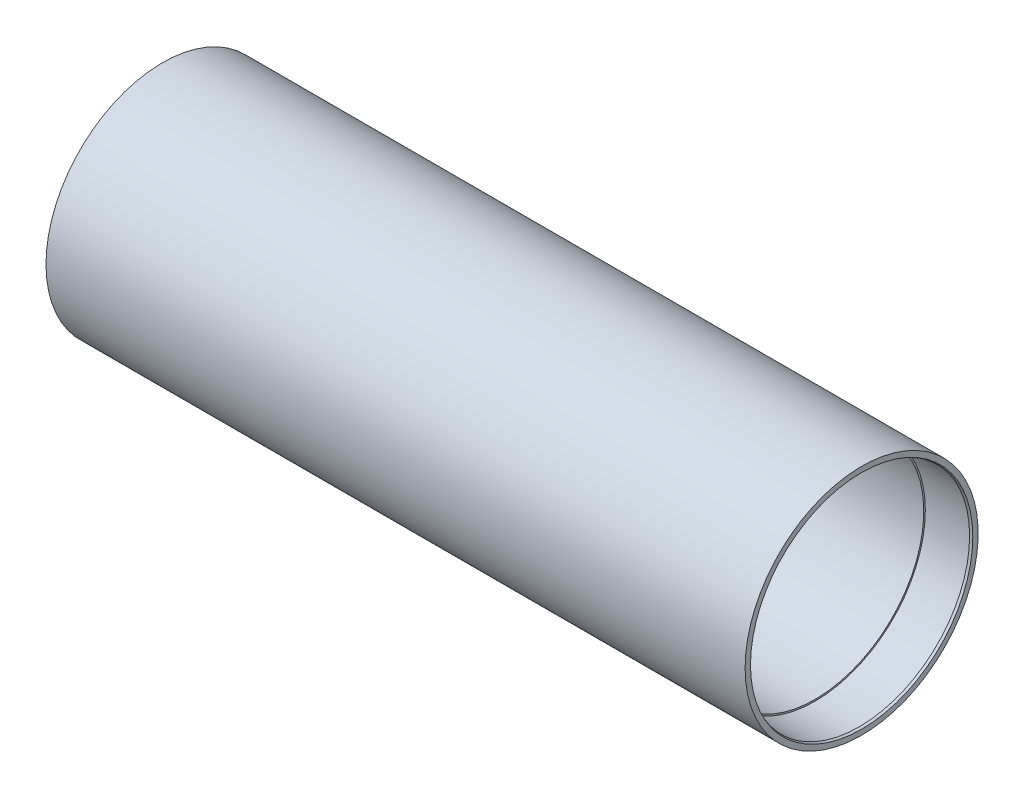
ISO-10303-21;
HEADER;
FILE_DESCRIPTION(('STEP AP214'),'2;1');
FILE_NAME('part.step','',(''),(''),'','','');
FILE_SCHEMA(('AUTOMOTIVE_DESIGN { 1 0 10303 214 1 1 1 1 }'));
ENDSEC;
DATA;
#1=APPLICATION_CONTEXT('core data for automotive mechanical design processes');
#2=APPLICATION_PROTOCOL_DEFINITION('international standard','automotive_design',2000,#1);
#3=PRODUCT_CONTEXT('',#1,'mechanical');
#4=PRODUCT('Part','Part','',(#3));
#5=PRODUCT_RELATED_PRODUCT_CATEGORY('part','',(#4));
#6=PRODUCT_DEFINITION_FORMATION('','',#4);
#7=PRODUCT_DEFINITION_CONTEXT('part definition',#1,'design');
#8=PRODUCT_DEFINITION('design','',#6,#7);
#9=PRODUCT_DEFINITION_SHAPE('','',#8);
#10=(LENGTH_UNIT() NAMED_UNIT(*) SI_UNIT(.MILLI.,.METRE.));
#11=(NAMED_UNIT(*) PLANE_ANGLE_UNIT() SI_UNIT($,.RADIAN.));
#12=(NAMED_UNIT(*) SI_UNIT($,.STERADIAN.) SOLID_ANGLE_UNIT());
#13=UNCERTAINTY_MEASURE_WITH_UNIT(LENGTH_MEASURE(1.E-05),#10,'distance_accuracy_value','');
#14=(GEOMETRIC_REPRESENTATION_CONTEXT(3) GLOBAL_UNCERTAINTY_ASSIGNED_CONTEXT((#13)) GLOBAL_UNIT_ASSIGNED_CONTEXT((#10,
#11,#12)) REPRESENTATION_CONTEXT('',''));
#15=CARTESIAN_POINT('',(0.,0.,0.));
#16=DIRECTION('',(0.,0.,1.));
#17=DIRECTION('',(1.,0.,0.));
#18=AXIS2_PLACEMENT_3D('',#15,#16,#17);
#19=CARTESIAN_POINT('',(0.,0.,0.));
#20=DIRECTION('',(-1.,0.,0.));
#21=DIRECTION('',(0.,0.,1.));
#22=AXIS2_PLACEMENT_3D('',#19,#20,#21);
#23=CYLINDRICAL_SURFACE('',#22,70.);
#24=CARTESIAN_POINT('',(195.,0.,0.));
#25=DIRECTION('',(-1.,0.,0.));
#26=DIRECTION('',(0.,0.,1.));
#27=AXIS2_PLACEMENT_3D('',#24,#25,#26);
#28=CIRCLE('',#27,70.);
#29=CARTESIAN_POINT('',(195.,0.,70.));
#30=VERTEX_POINT('',#29);
#31=EDGE_CURVE('E48',#30,#30,#28,.T.);
#32=ORIENTED_EDGE('',*,*,#31,.F.);
#33=EDGE_LOOP('',(#32));
#34=FACE_BOUND('',#33,.T.);
#35=CARTESIAN_POINT('',(-195.,0.,0.));
#36=DIRECTION('',(-1.,0.,0.));
#37=DIRECTION('',(0.,0.,1.));
#38=AXIS2_PLACEMENT_3D('',#35,#36,#37);
#39=CIRCLE('',#38,70.);
#40=CARTESIAN_POINT('',(-195.,0.,70.));
#41=VERTEX_POINT('',#40);
#42=EDGE_CURVE('E63',#41,#41,#39,.T.);
#43=ORIENTED_EDGE('',*,*,#42,.T.);
#44=EDGE_LOOP('',(#43));
#45=FACE_BOUND('',#44,.T.);
#46=ADVANCED_FACE('F37',(#34,#45),#23,.F.);
#47=CARTESIAN_POINT('',(-225.,75.,0.));
#48=DIRECTION('',(1.,0.,0.));
#49=DIRECTION('',(0.,0.,-1.));
#50=AXIS2_PLACEMENT_3D('',#47,#48,#49);
#51=PLANE('',#50);
#52=CARTESIAN_POINT('',(-225.,0.,0.));
#53=DIRECTION('',(-1.,0.,0.));
#54=DIRECTION('',(0.,0.,1.));
#55=AXIS2_PLACEMENT_3D('',#52,#53,#54);
#56=CIRCLE('',#55,71.55);
#57=CARTESIAN_POINT('',(-225.,0.,71.55));
#58=VERTEX_POINT('',#57);
#59=EDGE_CURVE('E72',#58,#58,#56,.T.);
#60=ORIENTED_EDGE('',*,*,#59,.F.);
#61=EDGE_LOOP('',(#60));
#62=FACE_BOUND('',#61,.T.);
#63=CARTESIAN_POINT('',(-225.,0.,0.));
#64=DIRECTION('',(-1.,0.,0.));
#65=DIRECTION('',(0.,0.,1.));
#66=AXIS2_PLACEMENT_3D('',#63,#64,#65);
#67=CIRCLE('',#66,75.);
#68=CARTESIAN_POINT('',(-225.,0.,75.));
#69=VERTEX_POINT('',#68);
#70=EDGE_CURVE('E44',#69,#69,#67,.T.);
#71=ORIENTED_EDGE('',*,*,#70,.T.);
#72=EDGE_LOOP('',(#71));
#73=FACE_BOUND('',#72,.T.);
#74=ADVANCED_FACE('F39',(#62,#73),#51,.F.);
#75=CARTESIAN_POINT('',(225.,70.,0.));
#76=DIRECTION('',(-1.,0.,0.));
#77=DIRECTION('',(0.,0.,1.));
#78=AXIS2_PLACEMENT_3D('',#75,#76,#77);
#79=PLANE('',#78);
#80=CARTESIAN_POINT('',(225.,0.,0.));
#81=DIRECTION('',(-1.,0.,0.));
#82=DIRECTION('',(0.,0.,1.));
#83=AXIS2_PLACEMENT_3D('',#80,#81,#82);
#84=CIRCLE('',#83,71.55);
#85=CARTESIAN_POINT('',(225.,0.,71.55));
#86=VERTEX_POINT('',#85);
#87=EDGE_CURVE('E60',#86,#86,#84,.T.);
#88=ORIENTED_EDGE('',*,*,#87,.T.);
#89=EDGE_LOOP('',(#88));
#90=FACE_BOUND('',#89,.T.);
#91=CARTESIAN_POINT('',(225.,0.,0.));
#92=DIRECTION('',(-1.,0.,0.));
#93=DIRECTION('',(0.,0.,1.));
#94=AXIS2_PLACEMENT_3D('',#91,#92,#93);
#95=CIRCLE('',#94,75.);
#96=CARTESIAN_POINT('',(225.,0.,75.));
#97=VERTEX_POINT('',#96);
#98=EDGE_CURVE('E10',#97,#97,#95,.T.);
#99=ORIENTED_EDGE('',*,*,#98,.F.);
#100=EDGE_LOOP('',(#99));
#101=FACE_BOUND('',#100,.T.);
#102=ADVANCED_FACE('F79',(#90,#101),#79,.F.);
#103=CARTESIAN_POINT('',(0.,0.,0.));
#104=DIRECTION('',(-1.,0.,0.));
#105=DIRECTION('',(0.,0.,1.));
#106=AXIS2_PLACEMENT_3D('',#103,#104,#105);
#107=CYLINDRICAL_SURFACE('',#106,75.);
#108=ORIENTED_EDGE('',*,*,#70,.F.);
#109=EDGE_LOOP('',(#108));
#110=FACE_BOUND('',#109,.T.);
#111=ORIENTED_EDGE('',*,*,#98,.T.);
#112=EDGE_LOOP('',(#111));
#113=FACE_BOUND('',#112,.T.);
#114=ADVANCED_FACE('F85',(#110,#113),#107,.T.);
#115=CARTESIAN_POINT('',(195.,70.,0.));
#116=DIRECTION('',(1.,0.,0.));
#117=DIRECTION('',(0.,0.,-1.));
#118=AXIS2_PLACEMENT_3D('',#115,#116,#117);
#119=PLANE('',#118);
#120=ORIENTED_EDGE('',*,*,#31,.T.);
#121=EDGE_LOOP('',(#120));
#122=FACE_BOUND('',#121,.T.);
#123=CARTESIAN_POINT('',(195.,0.,0.));
#124=DIRECTION('',(-1.,0.,0.));
#125=DIRECTION('',(0.,0.,1.));
#126=AXIS2_PLACEMENT_3D('',#123,#124,#125);
#127=CIRCLE('',#126,71.);
#128=CARTESIAN_POINT('',(195.,0.,71.));
#129=VERTEX_POINT('',#128);
#130=EDGE_CURVE('E52',#129,#129,#127,.T.);
#131=ORIENTED_EDGE('',*,*,#130,.F.);
#132=EDGE_LOOP('',(#131));
#133=FACE_BOUND('',#132,.T.);
#134=ADVANCED_FACE('F97',(#122,#133),#119,.T.);
#135=CARTESIAN_POINT('',(0.,0.,0.));
#136=DIRECTION('',(-1.,0.,0.));
#137=DIRECTION('',(0.,0.,1.));
#138=AXIS2_PLACEMENT_3D('',#135,#136,#137);
#139=CYLINDRICAL_SURFACE('',#138,71.);
#140=ORIENTED_EDGE('',*,*,#130,.T.);
#141=EDGE_LOOP('',(#140));
#142=FACE_BOUND('',#141,.T.);
#143=CARTESIAN_POINT('',(223.5,0.,0.));
#144=DIRECTION('',(-1.,0.,0.));
#145=DIRECTION('',(0.,0.,1.));
#146=AXIS2_PLACEMENT_3D('',#143,#144,#145);
#147=CIRCLE('',#146,71.);
#148=CARTESIAN_POINT('',(223.5,0.,71.));
#149=VERTEX_POINT('',#148);
#150=EDGE_CURVE('E57',#149,#149,#147,.T.);
#151=ORIENTED_EDGE('',*,*,#150,.F.);
#152=EDGE_LOOP('',(#151));
#153=FACE_BOUND('',#152,.T.);
#154=ADVANCED_FACE('F101',(#142,#153),#139,.F.);
#155=CARTESIAN_POINT('',(225.,0.,0.));
#156=DIRECTION('',(1.,0.,0.));
#157=DIRECTION('',(0.,0.,-1.));
#158=AXIS2_PLACEMENT_3D('',#155,#156,#157);
#159=CONICAL_SURFACE('',#158,71.55,0.351444794003548);
#160=ORIENTED_EDGE('',*,*,#150,.T.);
#161=EDGE_LOOP('',(#160));
#162=FACE_BOUND('',#161,.T.);
#163=ORIENTED_EDGE('',*,*,#87,.F.);
#164=EDGE_LOOP('',(#163));
#165=FACE_BOUND('',#164,.T.);
#166=ADVANCED_FACE('F105',(#162,#165),#159,.F.);
#167=CARTESIAN_POINT('',(-195.,70.,0.));
#168=DIRECTION('',(-1.,0.,0.));
#169=DIRECTION('',(0.,0.,-1.));
#170=AXIS2_PLACEMENT_3D('',#167,#168,#169);
#171=PLANE('',#170);
#172=ORIENTED_EDGE('',*,*,#42,.F.);
#173=EDGE_LOOP('',(#172));
#174=FACE_BOUND('',#173,.T.);
#175=CARTESIAN_POINT('',(-195.,0.,0.));
#176=DIRECTION('',(-1.,0.,0.));
#177=DIRECTION('',(0.,0.,1.));
#178=AXIS2_PLACEMENT_3D('',#175,#176,#177);
#179=CIRCLE('',#178,71.);
#180=CARTESIAN_POINT('',(-195.,0.,71.));
#181=VERTEX_POINT('',#180);
#182=EDGE_CURVE('E66',#181,#181,#179,.T.);
#183=ORIENTED_EDGE('',*,*,#182,.T.);
#184=EDGE_LOOP('',(#183));
#185=FACE_BOUND('',#184,.T.);
#186=ADVANCED_FACE('F108',(#174,#185),#171,.T.);
#187=CARTESIAN_POINT('',(0.,0.,0.));
#188=DIRECTION('',(1.,0.,0.));
#189=DIRECTION('',(0.,0.,1.));
#190=AXIS2_PLACEMENT_3D('',#187,#188,#189);
#191=CYLINDRICAL_SURFACE('',#190,71.);
#192=ORIENTED_EDGE('',*,*,#182,.F.);
#193=EDGE_LOOP('',(#192));
#194=FACE_BOUND('',#193,.T.);
#195=CARTESIAN_POINT('',(-223.5,0.,0.));
#196=DIRECTION('',(-1.,0.,0.));
#197=DIRECTION('',(0.,0.,1.));
#198=AXIS2_PLACEMENT_3D('',#195,#196,#197);
#199=CIRCLE('',#198,71.);
#200=CARTESIAN_POINT('',(-223.5,0.,71.));
#201=VERTEX_POINT('',#200);
#202=EDGE_CURVE('E69',#201,#201,#199,.T.);
#203=ORIENTED_EDGE('',*,*,#202,.T.);
#204=EDGE_LOOP('',(#203));
#205=FACE_BOUND('',#204,.T.);
#206=ADVANCED_FACE('F111',(#194,#205),#191,.F.);
#207=CARTESIAN_POINT('',(-225.,0.,0.));
#208=DIRECTION('',(-1.,0.,0.));
#209=DIRECTION('',(0.,0.,-1.));
#210=AXIS2_PLACEMENT_3D('',#207,#208,#209);
#211=CONICAL_SURFACE('',#210,71.55,0.351444794003548);
#212=ORIENTED_EDGE('',*,*,#202,.F.);
#213=EDGE_LOOP('',(#212));
#214=FACE_BOUND('',#213,.T.);
#215=ORIENTED_EDGE('',*,*,#59,.T.);
#216=EDGE_LOOP('',(#215));
#217=FACE_BOUND('',#216,.T.);
#218=ADVANCED_FACE('F76',(#214,#217),#211,.F.);
#219=CLOSED_SHELL('',(#46,#74,#102,#114,#134,#154,#166,#186,#206,#218));
#220=MANIFOLD_SOLID_BREP('B2',#219);
#221=ADVANCED_BREP_SHAPE_REPRESENTATION('',(#18,#220),#14);
#222=SHAPE_DEFINITION_REPRESENTATION(#9,#221);
ENDSEC;
END-ISO-10303-21;
